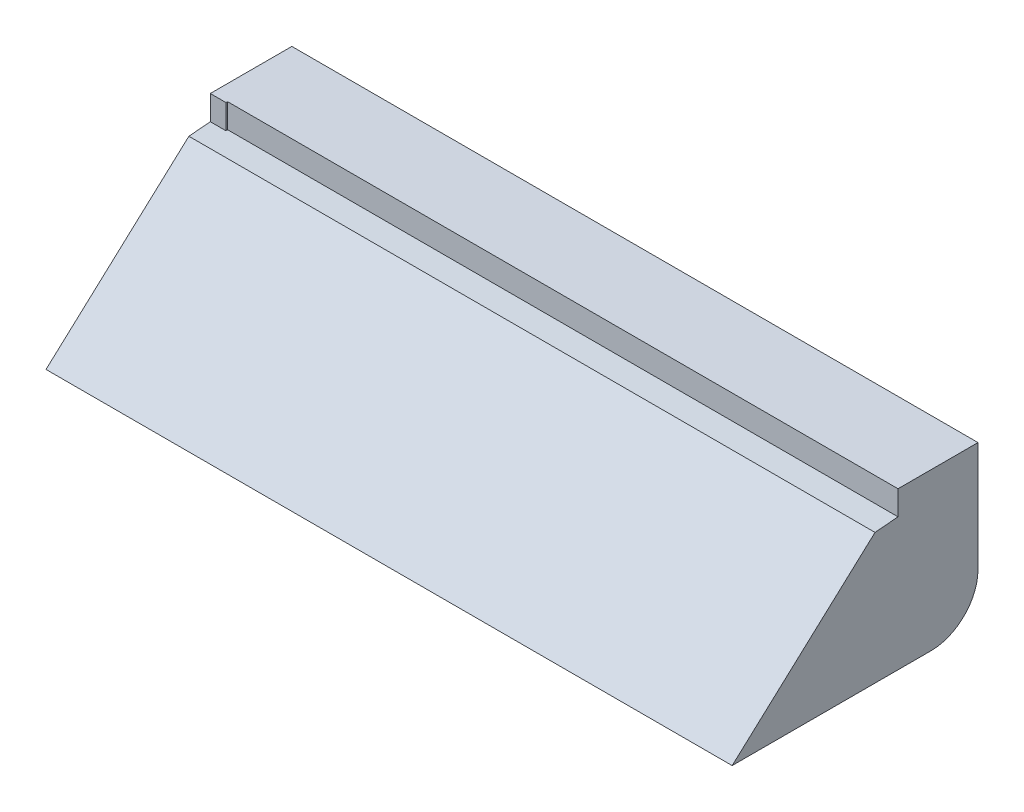
ISO-10303-21;
HEADER;
FILE_DESCRIPTION(('STEP AP214'),'2;1');
FILE_NAME('part.step','',(''),(''),'','','');
FILE_SCHEMA(('AUTOMOTIVE_DESIGN { 1 0 10303 214 1 1 1 1 }'));
ENDSEC;
DATA;
#1=APPLICATION_CONTEXT('core data for automotive mechanical design processes');
#2=APPLICATION_PROTOCOL_DEFINITION('international standard','automotive_design',2000,#1);
#3=PRODUCT_CONTEXT('',#1,'mechanical');
#4=PRODUCT('Part','Part','',(#3));
#5=PRODUCT_RELATED_PRODUCT_CATEGORY('part','',(#4));
#6=PRODUCT_DEFINITION_FORMATION('','',#4);
#7=PRODUCT_DEFINITION_CONTEXT('part definition',#1,'design');
#8=PRODUCT_DEFINITION('design','',#6,#7);
#9=PRODUCT_DEFINITION_SHAPE('','',#8);
#10=(LENGTH_UNIT() NAMED_UNIT(*) SI_UNIT(.MILLI.,.METRE.));
#11=(NAMED_UNIT(*) PLANE_ANGLE_UNIT() SI_UNIT($,.RADIAN.));
#12=(NAMED_UNIT(*) SI_UNIT($,.STERADIAN.) SOLID_ANGLE_UNIT());
#13=UNCERTAINTY_MEASURE_WITH_UNIT(LENGTH_MEASURE(1.E-05),#10,'distance_accuracy_value','');
#14=(GEOMETRIC_REPRESENTATION_CONTEXT(3) GLOBAL_UNCERTAINTY_ASSIGNED_CONTEXT((#13)) GLOBAL_UNIT_ASSIGNED_CONTEXT((#10,
#11,#12)) REPRESENTATION_CONTEXT('',''));
#15=CARTESIAN_POINT('',(0.,0.,0.));
#16=DIRECTION('',(0.,0.,1.));
#17=DIRECTION('',(1.,0.,0.));
#18=AXIS2_PLACEMENT_3D('',#15,#16,#17);
#19=CARTESIAN_POINT('',(-1370.,-290.,0.));
#20=DIRECTION('',(-1.,0.,0.));
#21=DIRECTION('',(0.,-1.,0.));
#22=AXIS2_PLACEMENT_3D('',#19,#20,#21);
#23=PLANE('',#22);
#24=DIRECTION('',(0.,-1.,0.));
#25=VECTOR('',#24,1.);
#26=CARTESIAN_POINT('',(-1370.,-790.,295.));
#27=LINE('',#26,#25);
#28=CARTESIAN_POINT('',(-1370.,-790.,295.));
#29=VERTEX_POINT('',#28);
#30=CARTESIAN_POINT('',(-1370.,-930.,295.));
#31=VERTEX_POINT('',#30);
#32=EDGE_CURVE('E11',#29,#31,#27,.T.);
#33=ORIENTED_EDGE('',*,*,#32,.T.);
#34=CARTESIAN_POINT('',(-1370.,-930.,355.));
#35=DIRECTION('',(-1.,0.,0.));
#36=DIRECTION('',(0.,0.,-1.));
#37=AXIS2_PLACEMENT_3D('',#34,#35,#36);
#38=CIRCLE('',#37,60.);
#39=CARTESIAN_POINT('',(-1370.,-990.,355.));
#40=VERTEX_POINT('',#39);
#41=EDGE_CURVE('E27',#31,#40,#38,.T.);
#42=ORIENTED_EDGE('',*,*,#41,.T.);
#43=DIRECTION('',(0.,0.,1.));
#44=VECTOR('',#43,1.);
#45=CARTESIAN_POINT('',(-1370.,-990.,355.));
#46=LINE('',#45,#44);
#47=CARTESIAN_POINT('',(-1370.,-990.,608.5));
#48=VERTEX_POINT('',#47);
#49=EDGE_CURVE('E126',#40,#48,#46,.T.);
#50=ORIENTED_EDGE('',*,*,#49,.T.);
#51=DIRECTION('',(0.,0.6744586000719,-0.7383126687177));
#52=VECTOR('',#51,1.);
#53=CARTESIAN_POINT('',(-1370.,-990.,608.5));
#54=LINE('',#53,#52);
#55=CARTESIAN_POINT('',(-1370.,-823.564008849,426.3067552489));
#56=VERTEX_POINT('',#55);
#57=EDGE_CURVE('E173',#48,#56,#54,.T.);
#58=ORIENTED_EDGE('',*,*,#57,.T.);
#59=DIRECTION('',(0.,0.0871557427476738,-0.996194698091744));
#60=VECTOR('',#59,1.);
#61=CARTESIAN_POINT('',(-1370.,-823.564008849,426.3067552489));
#62=LINE('',#61,#60);
#63=CARTESIAN_POINT('',(-1370.,-821.1749773271,399.));
#64=VERTEX_POINT('',#63);
#65=EDGE_CURVE('E113',#56,#64,#62,.T.);
#66=ORIENTED_EDGE('',*,*,#65,.T.);
#67=DIRECTION('',(0.,1.,0.));
#68=VECTOR('',#67,1.);
#69=CARTESIAN_POINT('',(-1370.,-821.1749773271,399.));
#70=LINE('',#69,#68);
#71=CARTESIAN_POINT('',(-1370.,-790.,399.));
#72=VERTEX_POINT('',#71);
#73=EDGE_CURVE('E107',#64,#72,#70,.T.);
#74=ORIENTED_EDGE('',*,*,#73,.T.);
#75=DIRECTION('',(0.,0.,-1.));
#76=VECTOR('',#75,1.);
#77=CARTESIAN_POINT('',(-1370.,-790.,399.));
#78=LINE('',#77,#76);
#79=EDGE_CURVE('E100',#72,#29,#78,.T.);
#80=ORIENTED_EDGE('',*,*,#79,.T.);
#81=EDGE_LOOP('',(#33,#42,#50,#58,#66,#74,#80));
#82=FACE_BOUND('',#81,.T.);
#83=ADVANCED_FACE('F17',(#82),#23,.T.);
#84=CARTESIAN_POINT('',(-1370.,-790.,397.));
#85=DIRECTION('',(0.,1.,0.));
#86=DIRECTION('',(0.,0.,-1.));
#87=AXIS2_PLACEMENT_3D('',#84,#85,#86);
#88=PLANE('',#87);
#89=DIRECTION('',(0.,0.,-1.));
#90=VECTOR('',#89,1.);
#91=CARTESIAN_POINT('',(-495.,-790.,397.));
#92=LINE('',#91,#90);
#93=CARTESIAN_POINT('',(-495.,-790.,397.));
#94=VERTEX_POINT('',#93);
#95=CARTESIAN_POINT('',(-495.,-790.,295.));
#96=VERTEX_POINT('',#95);
#97=EDGE_CURVE('E108',#94,#96,#92,.T.);
#98=ORIENTED_EDGE('',*,*,#97,.T.);
#99=DIRECTION('',(1.,0.,0.));
#100=VECTOR('',#99,1.);
#101=CARTESIAN_POINT('',(-1370.,-790.,295.));
#102=LINE('',#101,#100);
#103=EDGE_CURVE('E63',#29,#96,#102,.T.);
#104=ORIENTED_EDGE('',*,*,#103,.F.);
#105=ORIENTED_EDGE('',*,*,#79,.F.);
#106=DIRECTION('',(1.,0.,0.));
#107=VECTOR('',#106,1.);
#108=CARTESIAN_POINT('',(-1370.,-790.,399.));
#109=LINE('',#108,#107);
#110=CARTESIAN_POINT('',(-1350.,-790.,399.));
#111=VERTEX_POINT('',#110);
#112=EDGE_CURVE('E104',#72,#111,#109,.T.);
#113=ORIENTED_EDGE('',*,*,#112,.T.);
#114=DIRECTION('',(0.,0.,-1.));
#115=VECTOR('',#114,1.);
#116=CARTESIAN_POINT('',(-1350.,-790.,399.));
#117=LINE('',#116,#115);
#118=CARTESIAN_POINT('',(-1350.,-790.,397.));
#119=VERTEX_POINT('',#118);
#120=EDGE_CURVE('E71',#111,#119,#117,.T.);
#121=ORIENTED_EDGE('',*,*,#120,.T.);
#122=DIRECTION('',(1.,0.,0.));
#123=VECTOR('',#122,1.);
#124=CARTESIAN_POINT('',(-1350.,-790.,397.));
#125=LINE('',#124,#123);
#126=EDGE_CURVE('E122',#119,#94,#125,.T.);
#127=ORIENTED_EDGE('',*,*,#126,.T.);
#128=EDGE_LOOP('',(#98,#104,#105,#113,#121,#127));
#129=FACE_BOUND('',#128,.T.);
#130=ADVANCED_FACE('F102',(#129),#88,.T.);
#131=CARTESIAN_POINT('',(-1370.,-821.,397.));
#132=DIRECTION('',(0.,0.,1.));
#133=DIRECTION('',(1.,0.,0.));
#134=AXIS2_PLACEMENT_3D('',#131,#132,#133);
#135=PLANE('',#134);
#136=DIRECTION('',(-1.,0.,0.));
#137=VECTOR('',#136,1.);
#138=CARTESIAN_POINT('',(-495.,-821.,397.));
#139=LINE('',#138,#137);
#140=CARTESIAN_POINT('',(-495.,-821.,397.));
#141=VERTEX_POINT('',#140);
#142=CARTESIAN_POINT('',(-1350.,-821.,397.));
#143=VERTEX_POINT('',#142);
#144=EDGE_CURVE('E145',#141,#143,#139,.T.);
#145=ORIENTED_EDGE('',*,*,#144,.F.);
#146=DIRECTION('',(0.,1.,0.));
#147=VECTOR('',#146,1.);
#148=CARTESIAN_POINT('',(-495.,-821.,397.));
#149=LINE('',#148,#147);
#150=EDGE_CURVE('E151',#141,#94,#149,.T.);
#151=ORIENTED_EDGE('',*,*,#150,.T.);
#152=ORIENTED_EDGE('',*,*,#126,.F.);
#153=DIRECTION('',(0.,1.,0.));
#154=VECTOR('',#153,1.);
#155=CARTESIAN_POINT('',(-1350.,-821.,397.));
#156=LINE('',#155,#154);
#157=EDGE_CURVE('E153',#143,#119,#156,.T.);
#158=ORIENTED_EDGE('',*,*,#157,.F.);
#159=EDGE_LOOP('',(#145,#151,#152,#158));
#160=FACE_BOUND('',#159,.T.);
#161=ADVANCED_FACE('F167',(#160),#135,.T.);
#162=CARTESIAN_POINT('',(-1350.,-290.,0.));
#163=DIRECTION('',(-1.,0.,0.));
#164=DIRECTION('',(0.,-1.,0.));
#165=AXIS2_PLACEMENT_3D('',#162,#163,#164);
#166=PLANE('',#165);
#167=DIRECTION('',(0.,-0.0871557427475758,0.996194698091753));
#168=VECTOR('',#167,1.);
#169=CARTESIAN_POINT('',(-1350.,-821.,397.));
#170=LINE('',#169,#168);
#171=CARTESIAN_POINT('',(-1350.,-821.1749773271,399.));
#172=VERTEX_POINT('',#171);
#173=EDGE_CURVE('E129',#143,#172,#170,.T.);
#174=ORIENTED_EDGE('',*,*,#173,.F.);
#175=ORIENTED_EDGE('',*,*,#157,.T.);
#176=ORIENTED_EDGE('',*,*,#120,.F.);
#177=DIRECTION('',(0.,1.,0.));
#178=VECTOR('',#177,1.);
#179=CARTESIAN_POINT('',(-1350.,-821.1749773271,399.));
#180=LINE('',#179,#178);
#181=EDGE_CURVE('E119',#172,#111,#180,.T.);
#182=ORIENTED_EDGE('',*,*,#181,.F.);
#183=EDGE_LOOP('',(#174,#175,#176,#182));
#184=FACE_BOUND('',#183,.T.);
#185=ADVANCED_FACE('F194',(#184),#166,.F.);
#186=CARTESIAN_POINT('',(-1370.,-821.1749773271,399.));
#187=DIRECTION('',(0.,0.,1.));
#188=DIRECTION('',(1.,0.,0.));
#189=AXIS2_PLACEMENT_3D('',#186,#187,#188);
#190=PLANE('',#189);
#191=DIRECTION('',(1.,0.,0.));
#192=VECTOR('',#191,1.);
#193=CARTESIAN_POINT('',(-1370.,-821.1749773271,399.));
#194=LINE('',#193,#192);
#195=EDGE_CURVE('E157',#64,#172,#194,.T.);
#196=ORIENTED_EDGE('',*,*,#195,.T.);
#197=ORIENTED_EDGE('',*,*,#181,.T.);
#198=ORIENTED_EDGE('',*,*,#112,.F.);
#199=ORIENTED_EDGE('',*,*,#73,.F.);
#200=EDGE_LOOP('',(#196,#197,#198,#199));
#201=FACE_BOUND('',#200,.T.);
#202=ADVANCED_FACE('F118',(#201),#190,.T.);
#203=CARTESIAN_POINT('',(-1370.,-821.,397.));
#204=DIRECTION('',(0.,0.996194698091745,0.0871557427476639));
#205=DIRECTION('',(-1.,0.,0.));
#206=AXIS2_PLACEMENT_3D('',#203,#204,#205);
#207=PLANE('',#206);
#208=ORIENTED_EDGE('',*,*,#195,.F.);
#209=ORIENTED_EDGE('',*,*,#65,.F.);
#210=DIRECTION('',(-1.,0.,0.));
#211=VECTOR('',#210,1.);
#212=CARTESIAN_POINT('',(-495.,-823.564008849,426.3067552489));
#213=LINE('',#212,#211);
#214=CARTESIAN_POINT('',(-495.,-823.564008849,426.3067552489));
#215=VERTEX_POINT('',#214);
#216=EDGE_CURVE('E140',#215,#56,#213,.T.);
#217=ORIENTED_EDGE('',*,*,#216,.F.);
#218=DIRECTION('',(0.,0.0871557427476639,-0.996194698091745));
#219=VECTOR('',#218,1.);
#220=CARTESIAN_POINT('',(-495.,-823.564008849,426.3067552489));
#221=LINE('',#220,#219);
#222=EDGE_CURVE('E147',#215,#141,#221,.T.);
#223=ORIENTED_EDGE('',*,*,#222,.T.);
#224=ORIENTED_EDGE('',*,*,#144,.T.);
#225=ORIENTED_EDGE('',*,*,#173,.T.);
#226=EDGE_LOOP('',(#208,#209,#217,#223,#224,#225));
#227=FACE_BOUND('',#226,.T.);
#228=ADVANCED_FACE('F170',(#227),#207,.T.);
#229=CARTESIAN_POINT('',(-495.,-290.,0.));
#230=DIRECTION('',(-1.,0.,0.));
#231=DIRECTION('',(0.,-1.,0.));
#232=AXIS2_PLACEMENT_3D('',#229,#230,#231);
#233=PLANE('',#232);
#234=DIRECTION('',(0.,-1.,0.));
#235=VECTOR('',#234,1.);
#236=CARTESIAN_POINT('',(-495.,-790.,295.));
#237=LINE('',#236,#235);
#238=CARTESIAN_POINT('',(-495.,-930.,295.));
#239=VERTEX_POINT('',#238);
#240=EDGE_CURVE('E131',#96,#239,#237,.T.);
#241=ORIENTED_EDGE('',*,*,#240,.F.);
#242=ORIENTED_EDGE('',*,*,#97,.F.);
#243=ORIENTED_EDGE('',*,*,#150,.F.);
#244=ORIENTED_EDGE('',*,*,#222,.F.);
#245=DIRECTION('',(0.,0.6744586000719,-0.7383126687177));
#246=VECTOR('',#245,1.);
#247=CARTESIAN_POINT('',(-495.,-990.,608.5));
#248=LINE('',#247,#246);
#249=CARTESIAN_POINT('',(-495.,-990.,608.5));
#250=VERTEX_POINT('',#249);
#251=EDGE_CURVE('E96',#250,#215,#248,.T.);
#252=ORIENTED_EDGE('',*,*,#251,.F.);
#253=DIRECTION('',(0.,0.,1.));
#254=VECTOR('',#253,1.);
#255=CARTESIAN_POINT('',(-495.,-990.,355.));
#256=LINE('',#255,#254);
#257=CARTESIAN_POINT('',(-495.,-990.,355.));
#258=VERTEX_POINT('',#257);
#259=EDGE_CURVE('E92',#258,#250,#256,.T.);
#260=ORIENTED_EDGE('',*,*,#259,.F.);
#261=CARTESIAN_POINT('',(-495.,-930.,355.));
#262=DIRECTION('',(1.,0.,0.));
#263=DIRECTION('',(0.,-1.,0.));
#264=AXIS2_PLACEMENT_3D('',#261,#262,#263);
#265=CIRCLE('',#264,60.);
#266=EDGE_CURVE('E128',#258,#239,#265,.T.);
#267=ORIENTED_EDGE('',*,*,#266,.T.);
#268=EDGE_LOOP('',(#241,#242,#243,#244,#252,#260,#267));
#269=FACE_BOUND('',#268,.T.);
#270=ADVANCED_FACE('F166',(#269),#233,.F.);
#271=CARTESIAN_POINT('',(-1370.15648,-930.,355.));
#272=DIRECTION('',(1.,0.,0.));
#273=DIRECTION('',(0.,-1.,0.));
#274=AXIS2_PLACEMENT_3D('',#271,#272,#273);
#275=CYLINDRICAL_SURFACE('',#274,60.);
#276=DIRECTION('',(1.,0.,0.));
#277=VECTOR('',#276,1.);
#278=CARTESIAN_POINT('',(-1370.,-990.,355.));
#279=LINE('',#278,#277);
#280=EDGE_CURVE('E21',#40,#258,#279,.T.);
#281=ORIENTED_EDGE('',*,*,#280,.F.);
#282=ORIENTED_EDGE('',*,*,#41,.F.);
#283=DIRECTION('',(1.,0.,0.));
#284=VECTOR('',#283,1.);
#285=CARTESIAN_POINT('',(-1370.,-930.,295.));
#286=LINE('',#285,#284);
#287=EDGE_CURVE('E130',#31,#239,#286,.T.);
#288=ORIENTED_EDGE('',*,*,#287,.T.);
#289=ORIENTED_EDGE('',*,*,#266,.F.);
#290=EDGE_LOOP('',(#281,#282,#288,#289));
#291=FACE_BOUND('',#290,.T.);
#292=ADVANCED_FACE('F185',(#291),#275,.T.);
#293=CARTESIAN_POINT('',(-1370.,-790.,295.));
#294=DIRECTION('',(0.,0.,-1.));
#295=DIRECTION('',(0.,1.,0.));
#296=AXIS2_PLACEMENT_3D('',#293,#294,#295);
#297=PLANE('',#296);
#298=ORIENTED_EDGE('',*,*,#32,.F.);
#299=ORIENTED_EDGE('',*,*,#103,.T.);
#300=ORIENTED_EDGE('',*,*,#240,.T.);
#301=ORIENTED_EDGE('',*,*,#287,.F.);
#302=EDGE_LOOP('',(#298,#299,#300,#301));
#303=FACE_BOUND('',#302,.T.);
#304=ADVANCED_FACE('F178',(#303),#297,.T.);
#305=CARTESIAN_POINT('',(-1370.,-990.,295.));
#306=DIRECTION('',(0.,-1.,0.));
#307=DIRECTION('',(1.,0.,0.));
#308=AXIS2_PLACEMENT_3D('',#305,#306,#307);
#309=PLANE('',#308);
#310=ORIENTED_EDGE('',*,*,#259,.T.);
#311=DIRECTION('',(1.,0.,0.));
#312=VECTOR('',#311,1.);
#313=CARTESIAN_POINT('',(-1370.,-990.,608.5));
#314=LINE('',#313,#312);
#315=EDGE_CURVE('E137',#48,#250,#314,.T.);
#316=ORIENTED_EDGE('',*,*,#315,.F.);
#317=ORIENTED_EDGE('',*,*,#49,.F.);
#318=ORIENTED_EDGE('',*,*,#280,.T.);
#319=EDGE_LOOP('',(#310,#316,#317,#318));
#320=FACE_BOUND('',#319,.T.);
#321=ADVANCED_FACE('F19',(#320),#309,.T.);
#322=CARTESIAN_POINT('',(-1370.,-990.,608.5));
#323=DIRECTION('',(0.,0.7383126687177,0.6744586000719));
#324=DIRECTION('',(-1.,0.,0.));
#325=AXIS2_PLACEMENT_3D('',#322,#323,#324);
#326=PLANE('',#325);
#327=ORIENTED_EDGE('',*,*,#57,.F.);
#328=ORIENTED_EDGE('',*,*,#315,.T.);
#329=ORIENTED_EDGE('',*,*,#251,.T.);
#330=ORIENTED_EDGE('',*,*,#216,.T.);
#331=EDGE_LOOP('',(#327,#328,#329,#330));
#332=FACE_BOUND('',#331,.T.);
#333=ADVANCED_FACE('F172',(#332),#326,.T.);
#334=CLOSED_SHELL('',(#83,#130,#161,#185,#202,#228,#270,#292,#304,#321,#333));
#335=MANIFOLD_SOLID_BREP('B1',#334);
#336=ADVANCED_BREP_SHAPE_REPRESENTATION('',(#18,#335),#14);
#337=SHAPE_DEFINITION_REPRESENTATION(#9,#336);
ENDSEC;
END-ISO-10303-21;
